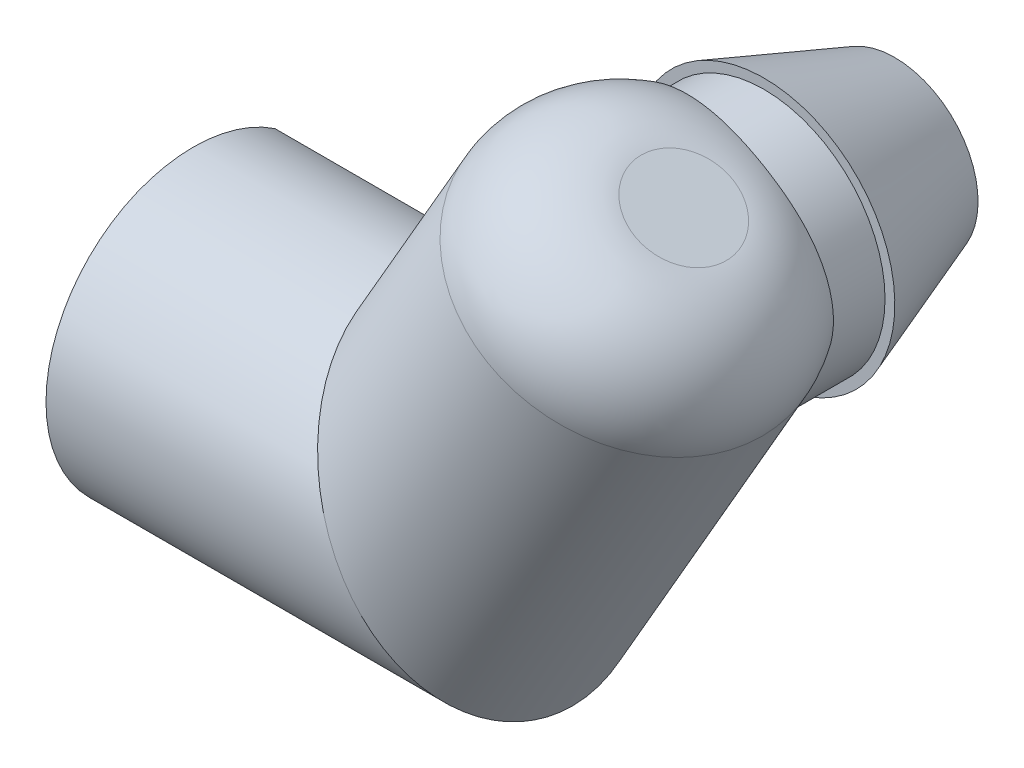
ISO-10303-21;
HEADER;
FILE_DESCRIPTION(('STEP AP214'),'2;1');
FILE_NAME('part.step','',(''),(''),'','','');
FILE_SCHEMA(('AUTOMOTIVE_DESIGN { 1 0 10303 214 1 1 1 1 }'));
ENDSEC;
DATA;
#1=APPLICATION_CONTEXT('core data for automotive mechanical design processes');
#2=APPLICATION_PROTOCOL_DEFINITION('international standard','automotive_design',2000,#1);
#3=PRODUCT_CONTEXT('',#1,'mechanical');
#4=PRODUCT('Part','Part','',(#3));
#5=PRODUCT_RELATED_PRODUCT_CATEGORY('part','',(#4));
#6=PRODUCT_DEFINITION_FORMATION('','',#4);
#7=PRODUCT_DEFINITION_CONTEXT('part definition',#1,'design');
#8=PRODUCT_DEFINITION('design','',#6,#7);
#9=PRODUCT_DEFINITION_SHAPE('','',#8);
#10=(LENGTH_UNIT() NAMED_UNIT(*) SI_UNIT(.MILLI.,.METRE.));
#11=(NAMED_UNIT(*) PLANE_ANGLE_UNIT() SI_UNIT($,.RADIAN.));
#12=(NAMED_UNIT(*) SI_UNIT($,.STERADIAN.) SOLID_ANGLE_UNIT());
#13=UNCERTAINTY_MEASURE_WITH_UNIT(LENGTH_MEASURE(1.E-05),#10,'distance_accuracy_value','');
#14=(GEOMETRIC_REPRESENTATION_CONTEXT(3) GLOBAL_UNCERTAINTY_ASSIGNED_CONTEXT((#13)) GLOBAL_UNIT_ASSIGNED_CONTEXT((#10,
#11,#12)) REPRESENTATION_CONTEXT('',''));
#15=CARTESIAN_POINT('',(0.,0.,0.));
#16=DIRECTION('',(0.,0.,1.));
#17=DIRECTION('',(1.,0.,0.));
#18=AXIS2_PLACEMENT_3D('',#15,#16,#17);
#19=CARTESIAN_POINT('',(3.,5.19615242270663,0.));
#20=DIRECTION('',(0.5,0.866025403784439,0.));
#21=DIRECTION('',(0.,0.,-1.));
#22=AXIS2_PLACEMENT_3D('',#19,#20,#21);
#23=PLANE('',#22);
#24=CARTESIAN_POINT('',(3.,5.19615242270663,0.));
#25=DIRECTION('',(0.5,0.866025403784439,0.));
#26=DIRECTION('',(-0.866025403784439,0.5,0.));
#27=AXIS2_PLACEMENT_3D('',#24,#25,#26);
#28=CIRCLE('',#27,0.749999999999999);
#29=CARTESIAN_POINT('',(2.35048094716167,5.57115242270663,0.));
#30=VERTEX_POINT('',#29);
#31=EDGE_CURVE('E197',#30,#30,#28,.T.);
#32=ORIENTED_EDGE('',*,*,#31,.T.);
#33=EDGE_LOOP('',(#32));
#34=FACE_BOUND('',#33,.T.);
#35=ADVANCED_FACE('F46',(#34),#23,.T.);
#36=CARTESIAN_POINT('',(-4.5,0.,0.));
#37=DIRECTION('',(1.,0.,0.));
#38=DIRECTION('',(0.,0.,-1.));
#39=AXIS2_PLACEMENT_3D('',#36,#37,#38);
#40=PLANE('',#39);
#41=CARTESIAN_POINT('',(-4.5,0.,0.));
#42=DIRECTION('',(1.,0.,0.));
#43=DIRECTION('',(0.,0.,-1.));
#44=AXIS2_PLACEMENT_3D('',#41,#42,#43);
#45=CIRCLE('',#44,1.125);
#46=CARTESIAN_POINT('',(-4.5,0.,-1.125));
#47=VERTEX_POINT('',#46);
#48=EDGE_CURVE('E185',#47,#47,#45,.T.);
#49=ORIENTED_EDGE('',*,*,#48,.T.);
#50=EDGE_LOOP('',(#49));
#51=FACE_BOUND('',#50,.T.);
#52=CARTESIAN_POINT('',(-4.5,0.,0.));
#53=DIRECTION('',(1.,0.,0.));
#54=DIRECTION('',(0.,0.,-1.));
#55=AXIS2_PLACEMENT_3D('',#52,#53,#54);
#56=CIRCLE('',#55,2.25);
#57=CARTESIAN_POINT('',(-4.5,1.87082869338697,-1.25));
#58=VERTEX_POINT('',#57);
#59=CARTESIAN_POINT('',(-4.5,-1.87082869338697,-1.25));
#60=VERTEX_POINT('',#59);
#61=EDGE_CURVE('E189',#58,#60,#56,.T.);
#62=ORIENTED_EDGE('',*,*,#61,.F.);
#63=DIRECTION('',(0.,-1.,0.));
#64=VECTOR('',#63,1.);
#65=CARTESIAN_POINT('',(-4.5,0.,-1.25));
#66=LINE('',#65,#64);
#67=EDGE_CURVE('E177',#58,#60,#66,.T.);
#68=ORIENTED_EDGE('',*,*,#67,.T.);
#69=EDGE_LOOP('',(#62,#68));
#70=FACE_BOUND('',#69,.T.);
#71=ADVANCED_FACE('F232',(#51,#70),#40,.F.);
#72=CARTESIAN_POINT('',(-1.47894191624432,-2.56160254037844,0.));
#73=DIRECTION('',(0.5,0.866025403784439,0.));
#74=DIRECTION('',(-0.866025403784439,0.5,0.));
#75=AXIS2_PLACEMENT_3D('',#72,#73,#74);
#76=CYLINDRICAL_SURFACE('',#75,2.25);
#77=DIRECTION('',(0.5,0.866025403784439,0.));
#78=VECTOR('',#77,1.);
#79=CARTESIAN_POINT('',(0.141243258357642,-3.49701688707193,-1.25));
#80=LINE('',#79,#78);
#81=CARTESIAN_POINT('',(3.87018517460236,2.96169997032885,-1.25));
#82=VERTEX_POINT('',#81);
#83=CARTESIAN_POINT('',(1.08012344973464,-1.87082869338697,-1.25));
#84=VERTEX_POINT('',#83);
#85=EDGE_CURVE('E168',#82,#84,#80,.F.);
#86=ORIENTED_EDGE('',*,*,#85,.F.);
#87=CARTESIAN_POINT('',(2.25,3.89711431702997,0.));
#88=DIRECTION('',(0.5,0.866025403784439,0.));
#89=DIRECTION('',(-0.866025403784439,0.5,0.));
#90=AXIS2_PLACEMENT_3D('',#87,#88,#89);
#91=CIRCLE('',#90,2.25);
#92=CARTESIAN_POINT('',(0.629814825398036,4.83252866372346,-1.25));
#93=VERTEX_POINT('',#92);
#94=EDGE_CURVE('E201',#82,#93,#91,.F.);
#95=ORIENTED_EDGE('',*,*,#94,.T.);
#96=DIRECTION('',(0.5,0.866025403784439,0.));
#97=VECTOR('',#96,1.);
#98=CARTESIAN_POINT('',(-3.09912709084629,-1.62618819368496,-1.25));
#99=LINE('',#98,#97);
#100=CARTESIAN_POINT('',(-1.08012344973464,1.87082869338697,-1.25));
#101=VERTEX_POINT('',#100);
#102=EDGE_CURVE('E71',#101,#93,#99,.T.);
#103=ORIENTED_EDGE('',*,*,#102,.F.);
#104=CARTESIAN_POINT('',(0.,0.,0.));
#105=DIRECTION('',(0.866025403784439,0.5,0.));
#106=DIRECTION('',(0.5,-0.866025403784439,0.));
#107=AXIS2_PLACEMENT_3D('',#104,#105,#106);
#108=ELLIPSE('',#107,2.59807621135332,2.25);
#109=EDGE_CURVE('E193',#84,#101,#108,.F.);
#110=ORIENTED_EDGE('',*,*,#109,.F.);
#111=EDGE_LOOP('',(#86,#95,#103,#110));
#112=FACE_BOUND('',#111,.T.);
#113=ADVANCED_FACE('F228',(#112),#76,.T.);
#114=CARTESIAN_POINT('',(-4.5,0.,0.));
#115=DIRECTION('',(1.,0.,0.));
#116=DIRECTION('',(0.,0.,-1.));
#117=AXIS2_PLACEMENT_3D('',#114,#115,#116);
#118=CYLINDRICAL_SURFACE('',#117,2.25);
#119=DIRECTION('',(1.,0.,0.));
#120=VECTOR('',#119,1.);
#121=CARTESIAN_POINT('',(-4.5,-1.87082869338697,-1.25));
#122=LINE('',#121,#120);
#123=EDGE_CURVE('E174',#84,#60,#122,.F.);
#124=ORIENTED_EDGE('',*,*,#123,.F.);
#125=ORIENTED_EDGE('',*,*,#109,.T.);
#126=DIRECTION('',(1.,0.,0.));
#127=VECTOR('',#126,1.);
#128=CARTESIAN_POINT('',(-4.5,1.87082869338697,-1.25));
#129=LINE('',#128,#127);
#130=EDGE_CURVE('E171',#58,#101,#129,.T.);
#131=ORIENTED_EDGE('',*,*,#130,.F.);
#132=ORIENTED_EDGE('',*,*,#61,.T.);
#133=EDGE_LOOP('',(#124,#125,#131,#132));
#134=FACE_BOUND('',#133,.T.);
#135=ADVANCED_FACE('F225',(#134),#118,.T.);
#136=CARTESIAN_POINT('',(2.25,3.89711431702997,0.));
#137=DIRECTION('',(0.5,0.866025403784439,0.));
#138=DIRECTION('',(-0.866025403784439,0.5,0.));
#139=AXIS2_PLACEMENT_3D('',#136,#137,#138);
#140=DEGENERATE_TOROIDAL_SURFACE('',#139,0.749999999999999,1.5,.T.);
#141=CARTESIAN_POINT('',(2.76882253032927,5.22301415914836,-1.25));
#142=CARTESIAN_POINT('',(2.83878601189705,5.18820996694728,-1.25));
#143=CARTESIAN_POINT('',(2.90752373776387,5.15094444709369,-1.25));
#144=CARTESIAN_POINT('',(3.0424477556737,5.07198939018065,-1.25));
#145=CARTESIAN_POINT('',(3.10863287233132,5.0302978474841,-1.25));
#146=CARTESIAN_POINT('',(3.23756384943671,4.94241510843654,-1.25));
#147=CARTESIAN_POINT('',(3.30032318479026,4.89624387905459,-1.25));
#148=CARTESIAN_POINT('',(3.42154530029649,4.79858700891688,-1.25));
#149=CARTESIAN_POINT('',(3.48001048750219,4.74710438495034,-1.25));
#150=CARTESIAN_POINT('',(3.60133951580253,4.62810121790016,-1.25));
#151=CARTESIAN_POINT('',(3.66304303436849,4.55937105525047,-1.25));
#152=CARTESIAN_POINT('',(3.77517523278892,4.41321792378568,-1.25));
#153=CARTESIAN_POINT('',(3.82561383076,4.33580269262962,-1.25));
#154=CARTESIAN_POINT('',(3.91256879516992,4.17237874978207,-1.25));
#155=CARTESIAN_POINT('',(3.94893873914843,4.08629082947665,-1.25));
#156=CARTESIAN_POINT('',(4.00416284000441,3.90857132837355,-1.25));
#157=CARTESIAN_POINT('',(4.02302070327241,3.81694092500415,-1.25));
#158=CARTESIAN_POINT('',(4.04007288762766,3.64396505627365,-1.25));
#159=CARTESIAN_POINT('',(4.04066033382444,3.56285334689579,-1.25));
#160=CARTESIAN_POINT('',(4.02661892544629,3.40197085098637,-1.25));
#161=CARTESIAN_POINT('',(4.01200212979591,3.32219905268627,-1.25));
#162=CARTESIAN_POINT('',(3.97000071930664,3.17470851145254,-1.25));
#163=CARTESIAN_POINT('',(3.94403742781129,3.10658177737824,-1.25));
#164=CARTESIAN_POINT('',(3.88066648004697,2.97588052894349,-1.25));
#165=CARTESIAN_POINT('',(3.8432615750651,2.91330468445971,-1.25));
#166=CARTESIAN_POINT('',(3.75952874460114,2.79749822624789,-1.25));
#167=CARTESIAN_POINT('',(3.71352541609736,2.74403228560709,-1.25));
#168=CARTESIAN_POINT('',(3.613273607413,2.64551471482593,-1.25));
#169=CARTESIAN_POINT('',(3.55902622434571,2.60046196683893,-1.25));
#170=CARTESIAN_POINT('',(3.44338325404398,2.51945348753679,-1.25));
#171=CARTESIAN_POINT('',(3.38192631961752,2.48358554493413,-1.25));
#172=CARTESIAN_POINT('',(3.25406921745253,2.42212662966504,-1.25));
#173=CARTESIAN_POINT('',(3.18766698270805,2.39653998321194,-1.25));
#174=CARTESIAN_POINT('',(3.04831667352323,2.3548114300683,-1.25));
#175=CARTESIAN_POINT('',(2.97520736074134,2.33921050620541,-1.25));
#176=CARTESIAN_POINT('',(2.82758314658712,2.31920960417219,-1.25));
#177=CARTESIAN_POINT('',(2.75306910570641,2.31480297982011,-1.25));
#178=CARTESIAN_POINT('',(2.57477994355988,2.31665407462239,-1.25));
#179=CARTESIAN_POINT('',(2.47104139778153,2.32779673803108,-1.25));
#180=CARTESIAN_POINT('',(2.31784845093846,2.35696611591871,-1.25));
#181=CARTESIAN_POINT('',(2.26706218530228,2.36881066537502,-1.25));
#182=CARTESIAN_POINT('',(2.16647438454394,2.3961511073304,-1.25));
#183=CARTESIAN_POINT('',(2.11667281181362,2.41164686008675,-1.25));
#184=CARTESIAN_POINT('',(1.98547402608927,2.45710336077601,-1.25));
#185=CARTESIAN_POINT('',(1.90504215690615,2.48983905544764,-1.25));
#186=CARTESIAN_POINT('',(1.74716900834114,2.56196522228046,-1.25));
#187=CARTESIAN_POINT('',(1.66973144815453,2.60136366332485,-1.25));
#188=CARTESIAN_POINT('',(1.51789007492057,2.68570008575924,-1.25));
#189=CARTESIAN_POINT('',(1.44348785149805,2.73064092140732,-1.25));
#190=CARTESIAN_POINT('',(1.29841936353685,2.82610728164475,-1.25));
#191=CARTESIAN_POINT('',(1.22774923874489,2.87662686178315,-1.25));
#192=CARTESIAN_POINT('',(1.11932337803505,2.96224002368142,-1.25));
#193=CARTESIAN_POINT('',(1.07990127203737,2.99521910875571,-1.25));
#194=CARTESIAN_POINT('',(1.00328343054179,3.06365770781396,-1.25));
#195=CARTESIAN_POINT('',(0.966087638173963,3.09911715838815,-1.25));
#196=CARTESIAN_POINT('',(0.858826856983154,3.20921873994056,-1.25));
#197=CARTESIAN_POINT('',(0.792707427791544,3.28787473087939,-1.25));
#198=CARTESIAN_POINT('',(0.68562889611132,3.44125583495667,-1.25));
#199=CARTESIAN_POINT('',(0.642296919909629,3.51431669881696,-1.25));
#200=CARTESIAN_POINT('',(0.568254062409525,3.66675883312603,-1.25));
#201=CARTESIAN_POINT('',(0.53755502102077,3.74614594991817,-1.25));
#202=CARTESIAN_POINT('',(0.490773612520746,3.90970430864653,-1.25));
#203=CARTESIAN_POINT('',(0.474782215272155,3.99390194905053,-1.25));
#204=CARTESIAN_POINT('',(0.459214401015466,4.16379931493219,-1.25));
#205=CARTESIAN_POINT('',(0.459625169606661,4.24949781551994,-1.25));
#206=CARTESIAN_POINT('',(0.476379752691128,4.40923016088565,-1.25));
#207=CARTESIAN_POINT('',(0.490866028825033,4.48346200520048,-1.25));
#208=CARTESIAN_POINT('',(0.532875619484055,4.62813911661286,-1.25));
#209=CARTESIAN_POINT('',(0.560394110820189,4.6985857738671,-1.25));
#210=CARTESIAN_POINT('',(0.625714671446492,4.82944371746596,-1.25));
#211=CARTESIAN_POINT('',(0.662828181525318,4.89020000899697,-1.25));
#212=CARTESIAN_POINT('',(0.746816201990236,5.00453098249614,-1.25));
#213=CARTESIAN_POINT('',(0.793689256457138,5.05810673369295,-1.25));
#214=CARTESIAN_POINT('',(0.895302353570424,5.15618632793598,-1.25));
#215=CARTESIAN_POINT('',(0.949969258523963,5.20076611508682,-1.25));
#216=CARTESIAN_POINT('',(1.06582739223811,5.28040584937879,-1.25));
#217=CARTESIAN_POINT('',(1.12701870618722,5.31546567219758,-1.25));
#218=CARTESIAN_POINT('',(1.25603840457472,5.37634503130925,-1.25));
#219=CARTESIAN_POINT('',(1.32400934914753,5.40186139997097,-1.25));
#220=CARTESIAN_POINT('',(1.46308312994784,5.442011805509,-1.25));
#221=CARTESIAN_POINT('',(1.5341871616844,5.45664164959304,-1.25));
#222=CARTESIAN_POINT('',(1.68338662985202,5.47608729487748,-1.25));
#223=CARTESIAN_POINT('',(1.76159229052823,5.48004126518966,-1.25));
#224=CARTESIAN_POINT('',(1.91766870564071,5.47668404773504,-1.25));
#225=CARTESIAN_POINT('',(1.99553959112014,5.46937776620781,-1.25));
#226=CARTESIAN_POINT('',(2.13312260540774,5.4476186907361,-1.25));
#227=CARTESIAN_POINT('',(2.19314734742679,5.43503470512446,-1.25));
#228=CARTESIAN_POINT('',(2.3118885286075,5.40466430444159,-1.25));
#229=CARTESIAN_POINT('',(2.37060418508865,5.38687486236935,-1.25));
#230=CARTESIAN_POINT('',(2.4868229581396,5.34683175289038,-1.25));
#231=CARTESIAN_POINT('',(2.54431790741139,5.32455471193729,-1.25));
#232=CARTESIAN_POINT('',(2.65773657108753,5.27636612527919,-1.25));
#233=CARTESIAN_POINT('',(2.71366053843083,5.25045516873231,-1.25));
#234=CARTESIAN_POINT('',(2.76882253032927,5.22301415914836,-1.25));
#235=B_SPLINE_CURVE_WITH_KNOTS('',3,(#141,#142,#143,#144,#145,#146,#147,#148,#149,#150,#151,
#152,#153,#154,#155,#156,#157,#158,#159,#160,#161,#162,#163,#164,#165,#166,#167,#168,#169,#170,
#171,#172,#173,#174,#175,#176,#177,#178,#179,#180,#181,#182,#183,#184,#185,#186,#187,#188,#189,
#190,#191,#192,#193,#194,#195,#196,#197,#198,#199,#200,#201,#202,#203,#204,#205,#206,#207,#208,
#209,#210,#211,#212,#213,#214,#215,#216,#217,#218,#219,#220,#221,#222,#223,#224,#225,#226,#227,
#228,#229,#230,#231,#232,#233,#234),.UNSPECIFIED.,.T.,.F.,(4,2,2,2,2,2,2,2,2,2,2,2,2,2,2,2,2,2,
2,2,2,2,2,2,2,2,2,2,2,2,2,2,2,2,2,2,2,2,2,2,2,2,2,2,2,2,4),(0.,0.23438798440669,
0.468882637992451,0.702376323444494,0.93573811073107,1.21190565453802,1.48782908162622,
1.76655157149598,2.04521505695532,2.28719943446279,2.5289920333847,2.74663043881367,
2.96421655129943,3.17482534342452,3.3854061323755,3.59793026544326,3.81054373202733,
4.03387245347089,4.25706855111464,4.56819011471147,4.7245378626682,4.88087962768977,
5.1409758739427,5.40138543370549,5.66192966529886,5.92219890419679,6.07629229186219,
6.23038174161763,6.5371347976684,6.79094892089219,7.04500038637828,7.30061284854124,
7.55602561412674,7.78175030084016,8.00739151264139,8.21995324568357,8.43248329166654,
8.64313626844578,8.8537919960348,9.07066334109022,9.28761816793463,9.52162679979928,
9.75553349985254,9.93927363837259,10.1231208358295,10.3079515779011,10.4927523883697),.UNSPECIFIED.);
#236=EDGE_CURVE('E56',#93,#82,#235,.T.);
#237=ORIENTED_EDGE('',*,*,#236,.F.);
#238=ORIENTED_EDGE('',*,*,#94,.F.);
#239=EDGE_LOOP('',(#237,#238));
#240=FACE_BOUND('',#239,.T.);
#241=ORIENTED_EDGE('',*,*,#31,.F.);
#242=EDGE_LOOP('',(#241));
#243=FACE_BOUND('',#242,.T.);
#244=ADVANCED_FACE('F48',(#240,#243),#140,.T.);
#245=CARTESIAN_POINT('',(1.2,0.,0.));
#246=DIRECTION('',(-1.,0.,0.));
#247=DIRECTION('',(0.,0.,1.));
#248=AXIS2_PLACEMENT_3D('',#245,#246,#247);
#249=PLANE('',#248);
#250=CARTESIAN_POINT('',(1.2,0.,0.));
#251=DIRECTION('',(-1.,0.,0.));
#252=DIRECTION('',(0.,0.,1.));
#253=AXIS2_PLACEMENT_3D('',#250,#251,#252);
#254=CIRCLE('',#253,1.125);
#255=CARTESIAN_POINT('',(1.2,0.,1.125));
#256=VERTEX_POINT('',#255);
#257=EDGE_CURVE('E181',#256,#256,#254,.T.);
#258=ORIENTED_EDGE('',*,*,#257,.T.);
#259=EDGE_LOOP('',(#258));
#260=FACE_BOUND('',#259,.T.);
#261=ADVANCED_FACE('F220',(#260),#249,.T.);
#262=CARTESIAN_POINT('',(-5.5,0.,0.));
#263=DIRECTION('',(1.,0.,0.));
#264=DIRECTION('',(0.,0.,-1.));
#265=AXIS2_PLACEMENT_3D('',#262,#263,#264);
#266=CYLINDRICAL_SURFACE('',#265,1.125);
#267=ORIENTED_EDGE('',*,*,#48,.F.);
#268=EDGE_LOOP('',(#267));
#269=FACE_BOUND('',#268,.T.);
#270=ORIENTED_EDGE('',*,*,#257,.F.);
#271=EDGE_LOOP('',(#270));
#272=FACE_BOUND('',#271,.T.);
#273=ADVANCED_FACE('F215',(#269,#272),#266,.F.);
#274=CARTESIAN_POINT('',(0.,0.,-1.25));
#275=DIRECTION('',(0.,0.,1.));
#276=DIRECTION('',(1.,0.,0.));
#277=AXIS2_PLACEMENT_3D('',#274,#275,#276);
#278=PLANE('',#277);
#279=CARTESIAN_POINT('',(1.77741445898117,3.07857214906294,-1.25));
#280=DIRECTION('',(0.,0.,1.));
#281=DIRECTION('',(1.,0.,0.));
#282=AXIS2_PLACEMENT_3D('',#279,#280,#281);
#283=CIRCLE('',#282,1.85);
#284=CARTESIAN_POINT('',(3.62741445898117,3.07857214906294,-1.25));
#285=VERTEX_POINT('',#284);
#286=EDGE_CURVE('E11',#285,#285,#283,.F.);
#287=ORIENTED_EDGE('',*,*,#286,.F.);
#288=EDGE_LOOP('',(#287));
#289=FACE_BOUND('',#288,.T.);
#290=ORIENTED_EDGE('',*,*,#130,.T.);
#291=ORIENTED_EDGE('',*,*,#102,.T.);
#292=ORIENTED_EDGE('',*,*,#236,.T.);
#293=ORIENTED_EDGE('',*,*,#85,.T.);
#294=ORIENTED_EDGE('',*,*,#123,.T.);
#295=ORIENTED_EDGE('',*,*,#67,.F.);
#296=EDGE_LOOP('',(#290,#291,#292,#293,#294,#295));
#297=FACE_BOUND('',#296,.T.);
#298=ADVANCED_FACE('F209',(#289,#297),#278,.F.);
#299=CARTESIAN_POINT('',(1.77741445898117,3.07857214906294,-2.45));
#300=DIRECTION('',(0.,0.,1.));
#301=DIRECTION('',(1.,0.,0.));
#302=AXIS2_PLACEMENT_3D('',#299,#300,#301);
#303=CYLINDRICAL_SURFACE('',#302,1.85);
#304=CARTESIAN_POINT('',(1.77741445898117,3.07857214906294,-2.45));
#305=DIRECTION('',(0.,0.,-1.));
#306=DIRECTION('',(-1.,0.,0.));
#307=AXIS2_PLACEMENT_3D('',#304,#305,#306);
#308=CIRCLE('',#307,1.85);
#309=CARTESIAN_POINT('',(-0.0314269360411833,3.46663504042667,-2.45));
#310=VERTEX_POINT('',#309);
#311=CARTESIAN_POINT('',(-0.0460973288215942,2.76663504042667,-2.45));
#312=VERTEX_POINT('',#311);
#313=EDGE_CURVE('E162',#310,#312,#308,.T.);
#314=ORIENTED_EDGE('',*,*,#313,.F.);
#315=DIRECTION('',(0.,0.,1.));
#316=VECTOR('',#315,1.);
#317=CARTESIAN_POINT('',(-0.0314269360411833,3.46663504042667,-2.45));
#318=LINE('',#317,#316);
#319=CARTESIAN_POINT('',(-0.0314269360411833,3.46663504042667,-2.05));
#320=VERTEX_POINT('',#319);
#321=EDGE_CURVE('E154',#310,#320,#318,.T.);
#322=ORIENTED_EDGE('',*,*,#321,.T.);
#323=CARTESIAN_POINT('',(1.77741445898117,3.07857214906294,-2.05));
#324=DIRECTION('',(0.,0.,-1.));
#325=DIRECTION('',(-1.,0.,0.));
#326=AXIS2_PLACEMENT_3D('',#323,#324,#325);
#327=CIRCLE('',#326,1.85);
#328=CARTESIAN_POINT('',(-0.0460973288215942,2.76663504042667,-2.05));
#329=VERTEX_POINT('',#328);
#330=EDGE_CURVE('E148',#329,#320,#327,.T.);
#331=ORIENTED_EDGE('',*,*,#330,.F.);
#332=DIRECTION('',(0.,0.,1.));
#333=VECTOR('',#332,1.);
#334=CARTESIAN_POINT('',(-0.0460973288215942,2.76663504042667,-2.45));
#335=LINE('',#334,#333);
#336=EDGE_CURVE('E381',#329,#312,#335,.F.);
#337=ORIENTED_EDGE('',*,*,#336,.T.);
#338=EDGE_LOOP('',(#314,#322,#331,#337));
#339=FACE_BOUND('',#338,.T.);
#340=ORIENTED_EDGE('',*,*,#286,.T.);
#341=EDGE_LOOP('',(#340));
#342=FACE_BOUND('',#341,.T.);
#343=ADVANCED_FACE('F214',(#339,#342),#303,.T.);
#344=CARTESIAN_POINT('',(1.77741445898117,3.07857214906294,-2.45));
#345=DIRECTION('',(0.,0.,1.));
#346=DIRECTION('',(-1.,0.,0.));
#347=AXIS2_PLACEMENT_3D('',#344,#345,#346);
#348=CONICAL_SURFACE('',#347,2.,0.349065850398867);
#349=CARTESIAN_POINT('',(1.77741445898117,3.07857214906294,-4.45));
#350=DIRECTION('',(0.,0.,-1.));
#351=DIRECTION('',(-1.,0.,0.));
#352=AXIS2_PLACEMENT_3D('',#349,#350,#351);
#353=CIRCLE('',#352,1.27205953146759);
#354=CARTESIAN_POINT('',(0.565992714111131,3.46663504042667,-4.45));
#355=VERTEX_POINT('',#354);
#356=CARTESIAN_POINT('',(0.544194814370694,2.76663504042667,-4.45));
#357=VERTEX_POINT('',#356);
#358=EDGE_CURVE('E139',#355,#357,#353,.T.);
#359=ORIENTED_EDGE('',*,*,#358,.F.);
#360=CARTESIAN_POINT('',(1.68458141656166,3.46663504042667,-6.8486776720888));
#361=CARTESIAN_POINT('',(1.67377089174622,3.46663504042667,-6.84173177073089));
#362=CARTESIAN_POINT('',(1.66349283560153,3.46663504042667,-6.83405816777647));
#363=CARTESIAN_POINT('',(1.6438629295756,3.46663504042667,-6.81768717309801));
#364=CARTESIAN_POINT('',(1.63450676620371,3.46663504042667,-6.80899501129484));
#365=CARTESIAN_POINT('',(1.60767523511878,3.46663504042667,-6.78212631420796));
#366=CARTESIAN_POINT('',(1.59119513958676,3.46663504042667,-6.76297825679974));
#367=CARTESIAN_POINT('',(1.56102708471366,3.46663504042667,-6.7247150980945));
#368=CARTESIAN_POINT('',(1.5472256164591,3.46663504042667,-6.70568559233913));
#369=CARTESIAN_POINT('',(1.52066853562139,3.46663504042667,-6.6669039222853));
#370=CARTESIAN_POINT('',(1.50791331514073,3.46663504042667,-6.64715149103036));
#371=CARTESIAN_POINT('',(1.47073880628135,3.46663504042667,-6.58714637532466));
#372=CARTESIAN_POINT('',(1.44745043510747,3.46663504042667,-6.54620046562674));
#373=CARTESIAN_POINT('',(1.40219050403799,3.46663504042667,-6.46257405590289));
#374=CARTESIAN_POINT('',(1.38025364743063,3.46663504042667,-6.41987529077029));
#375=CARTESIAN_POINT('',(1.33760040717552,3.46663504042667,-6.33393826547906));
#376=CARTESIAN_POINT('',(1.31688260366099,3.46663504042667,-6.29070070699986));
#377=CARTESIAN_POINT('',(1.25655651423559,3.46663504042667,-6.16174654752863));
#378=CARTESIAN_POINT('',(1.2181091461334,3.46663504042667,-6.07549059416128));
#379=CARTESIAN_POINT('',(1.14291439907062,3.46663504042667,-5.90223650095342));
#380=CARTESIAN_POINT('',(1.106167292292,3.46663504042667,-5.81523824490535));
#381=CARTESIAN_POINT('',(1.03371992130256,3.46663504042667,-5.64072357954121));
#382=CARTESIAN_POINT('',(0.998020544579732,3.46663504042667,-5.55320680235712));
#383=CARTESIAN_POINT('',(0.927345442545034,3.46663504042667,-5.3778899786417));
#384=CARTESIAN_POINT('',(0.892369666433567,3.46663504042667,-5.29008995249921));
#385=CARTESIAN_POINT('',(0.789123888919529,3.46663504042667,-5.02875528159149));
#386=CARTESIAN_POINT('',(0.7215760908191,3.46663504042667,-4.85493568786203));
#387=CARTESIAN_POINT('',(0.587581723677892,3.46663504042667,-4.50694802727575));
#388=CARTESIAN_POINT('',(0.521134760474619,3.46663504042667,-4.33278011131714));
#389=CARTESIAN_POINT('',(0.326833969640066,3.46663504042667,-3.82058797870052));
#390=CARTESIAN_POINT('',(0.199887267586226,3.46663504042667,-3.48221995465763));
#391=CARTESIAN_POINT('',(-0.0528856794299771,3.46663504042667,-2.80500720064685));
#392=CARTESIAN_POINT('',(-0.178711745287705,3.46663504042667,-2.4661624041562));
#393=CARTESIAN_POINT('',(-0.432252308727382,3.46663504042667,-1.78137803840738));
#394=CARTESIAN_POINT('',(-0.559953542584917,3.46663504042667,-1.43543355731525));
#395=CARTESIAN_POINT('',(-0.814902483953605,3.46663504042667,-0.743444791542309));
#396=CARTESIAN_POINT('',(-0.942150265434494,3.46663504042667,-0.397400534124006));
#397=CARTESIAN_POINT('',(-1.0693043245413,3.46663504042667,-0.0513223278636551));
#398=B_SPLINE_CURVE_WITH_KNOTS('',3,(#360,#361,#362,#363,#364,#365,#366,#367,#368,#369,#370,
#371,#372,#373,#374,#375,#376,#377,#378,#379,#380,#381,#382,#383,#384,#385,#386,#387,#388,#389,
#390,#391,#392,#393,#394,#395,#396,#397),.UNSPECIFIED.,.F.,.F.,(4,2,2,2,2,2,2,2,2,2,2,2,2,2,2,2,
2,2,4),(0.,0.0384384883023395,0.0766876099489771,0.152294850304922,0.222781544066415,
0.293294534579253,0.434522484997461,0.578515166135122,0.722336672385861,1.00560630779833,
1.28892113391368,1.57246939591833,1.85599768370687,2.41543897214837,2.97467541939285,
4.05886267520497,5.14322020799425,6.24950481503369,7.35559984020088),.UNSPECIFIED.);
#399=CARTESIAN_POINT('',(-0.184576160860427,3.46663504042667,-2.45));
#400=VERTEX_POINT('',#399);
#401=EDGE_CURVE('E386',#355,#400,#398,.T.);
#402=ORIENTED_EDGE('',*,*,#401,.T.);
#403=CARTESIAN_POINT('',(1.77741445898117,3.07857214906294,-2.45));
#404=DIRECTION('',(0.,0.,-1.));
#405=DIRECTION('',(-1.,0.,0.));
#406=AXIS2_PLACEMENT_3D('',#403,#404,#405);
#407=CIRCLE('',#406,2.);
#408=CARTESIAN_POINT('',(-0.198109582951915,2.76663504042667,-2.45));
#409=VERTEX_POINT('',#408);
#410=EDGE_CURVE('E152',#400,#409,#407,.T.);
#411=ORIENTED_EDGE('',*,*,#410,.T.);
#412=CARTESIAN_POINT('',(-1.07864854459014,2.76663504042667,-0.0513223278636475));
#413=CARTESIAN_POINT('',(-0.95052815923996,2.76663504042667,-0.401200855565559));
#414=CARTESIAN_POINT('',(-0.822346697366792,2.76663504042667,-0.751057229535196));
#415=CARTESIAN_POINT('',(-0.565713888791098,2.76663504042667,-1.45062995295448));
#416=CARTESIAN_POINT('',(-0.437262571333337,2.76663504042667,-1.80034631313489));
#417=CARTESIAN_POINT('',(-0.179962370267813,2.76663504042667,-2.49948937636176));
#418=CARTESIAN_POINT('',(-0.051113646923996,2.76663504042667,-2.84891613839926));
#419=CARTESIAN_POINT('',(0.207386554675265,2.76663504042667,-3.547513990873));
#420=CARTESIAN_POINT('',(0.337038113211084,2.76663504042667,-3.89668505170478));
#421=CARTESIAN_POINT('',(0.508614031963517,2.76663504042667,-4.35523651143774));
#422=CARTESIAN_POINT('',(0.549749811122546,2.76663504042667,-4.46491174979162));
#423=CARTESIAN_POINT('',(0.632263341372217,2.76663504042667,-4.6841676538823));
#424=CARTESIAN_POINT('',(0.673641085550311,2.76663504042667,-4.79374832221917));
#425=CARTESIAN_POINT('',(0.756719049606901,2.76663504042667,-5.01275578872821));
#426=CARTESIAN_POINT('',(0.798419185177146,2.76663504042667,-5.1221826188364));
#427=CARTESIAN_POINT('',(0.882305992538706,2.76663504042667,-5.34086179075477));
#428=CARTESIAN_POINT('',(0.924492710556255,2.76663504042667,-5.45011411484519));
#429=CARTESIAN_POINT('',(1.00962894703889,2.76663504042667,-5.66842225772397));
#430=CARTESIAN_POINT('',(1.05257904288961,2.76663504042667,-5.77747785250411));
#431=CARTESIAN_POINT('',(1.11791341893438,2.76663504042667,-5.94067826761349));
#432=CARTESIAN_POINT('',(1.1398396469458,2.76663504042667,-5.99500626497341));
#433=CARTESIAN_POINT('',(1.18410869697335,2.76663504042667,-6.10349803372571));
#434=CARTESIAN_POINT('',(1.20645155353304,2.76663504042667,-6.15766179106385));
#435=CARTESIAN_POINT('',(1.25173779577936,2.76663504042667,-6.26580953107762));
#436=CARTESIAN_POINT('',(1.27468182677879,2.76663504042667,-6.31979324405386));
#437=CARTESIAN_POINT('',(1.32140045606111,2.76663504042667,-6.42738877345526));
#438=CARTESIAN_POINT('',(1.34517486307177,2.76663504042667,-6.48100067215974));
#439=CARTESIAN_POINT('',(1.38183619050424,2.76663504042667,-6.56099926700241));
#440=CARTESIAN_POINT('',(1.39423078817247,2.76663504042667,-6.58761101783754));
#441=CARTESIAN_POINT('',(1.41945298605845,2.76663504042667,-6.64062517599886));
#442=CARTESIAN_POINT('',(1.43228053718246,2.76663504042667,-6.66702760664393));
#443=CARTESIAN_POINT('',(1.4585158180032,2.76663504042667,-6.71957236185929));
#444=CARTESIAN_POINT('',(1.47192400214013,2.76663504042667,-6.74571446225352));
#445=CARTESIAN_POINT('',(1.49957490517488,2.76663504042667,-6.79756488466785));
#446=CARTESIAN_POINT('',(1.51381795054813,2.76663504042667,-6.82327303185883));
#447=CARTESIAN_POINT('',(1.5286052516349,2.76663504042667,-6.84867767213632));
#448=B_SPLINE_CURVE_WITH_KNOTS('',3,(#412,#413,#414,#415,#416,#417,#418,#419,#420,#421,#422,
#423,#424,#425,#426,#427,#428,#429,#430,#431,#432,#433,#434,#435,#436,#437,#438,#439,#440,#441,
#442,#443,#444,#445,#446,#447),.UNSPECIFIED.,.F.,.F.,(4,2,2,2,2,2,2,2,2,2,2,2,2,2,2,2,2,4),(0.,
1.11779653859015,2.23547761690309,3.35275520627806,4.47014638374856,4.82155375516547,
5.17295113601483,5.52425953827073,5.87560159497006,6.22722176813069,6.40297789594007,
6.57874866144094,6.75471652875163,6.93064412680584,7.01871091177992,7.10676774395799,
7.19489478669907,7.28305652477314),.UNSPECIFIED.);
#449=EDGE_CURVE('E373',#409,#357,#448,.T.);
#450=ORIENTED_EDGE('',*,*,#449,.T.);
#451=EDGE_LOOP('',(#359,#402,#411,#450));
#452=FACE_BOUND('',#451,.T.);
#453=ADVANCED_FACE('F269',(#452),#348,.T.);
#454=CARTESIAN_POINT('',(1.77741445898117,3.07857214906294,-4.45));
#455=DIRECTION('',(0.,0.,-1.));
#456=DIRECTION('',(-1.,0.,0.));
#457=AXIS2_PLACEMENT_3D('',#454,#455,#456);
#458=PLANE('',#457);
#459=DIRECTION('',(1.,0.,0.));
#460=VECTOR('',#459,1.);
#461=CARTESIAN_POINT('',(1.10130839118897,3.46663504042667,-4.45));
#462=LINE('',#461,#460);
#463=CARTESIAN_POINT('',(1.02116900124511,3.46663504042667,-4.45));
#464=VERTEX_POINT('',#463);
#465=EDGE_CURVE('E141',#355,#464,#462,.T.);
#466=ORIENTED_EDGE('',*,*,#465,.F.);
#467=ORIENTED_EDGE('',*,*,#358,.T.);
#468=DIRECTION('',(-1.,0.,0.));
#469=VECTOR('',#468,1.);
#470=CARTESIAN_POINT('',(1.10130839118897,2.76663504042667,-4.45));
#471=LINE('',#470,#469);
#472=CARTESIAN_POINT('',(0.986721572801182,2.76663504042667,-4.45));
#473=VERTEX_POINT('',#472);
#474=EDGE_CURVE('E122',#473,#357,#471,.T.);
#475=ORIENTED_EDGE('',*,*,#474,.F.);
#476=CARTESIAN_POINT('',(1.77741445898117,3.07857214906294,-4.45));
#477=DIRECTION('',(0.,0.,-1.));
#478=DIRECTION('',(-1.,0.,0.));
#479=AXIS2_PLACEMENT_3D('',#476,#477,#478);
#480=CIRCLE('',#479,0.85);
#481=EDGE_CURVE('E137',#464,#473,#480,.T.);
#482=ORIENTED_EDGE('',*,*,#481,.F.);
#483=EDGE_LOOP('',(#466,#467,#475,#482));
#484=FACE_BOUND('',#483,.T.);
#485=ADVANCED_FACE('F136',(#484),#458,.T.);
#486=CARTESIAN_POINT('',(1.77741445898117,3.07857214906294,-2.45));
#487=DIRECTION('',(0.,0.,-1.));
#488=DIRECTION('',(-1.,0.,0.));
#489=AXIS2_PLACEMENT_3D('',#486,#487,#488);
#490=PLANE('',#489);
#491=ORIENTED_EDGE('',*,*,#410,.F.);
#492=DIRECTION('',(1.,0.,0.));
#493=VECTOR('',#492,1.);
#494=CARTESIAN_POINT('',(1.77741445898117,3.46663504042667,-2.45));
#495=LINE('',#494,#493);
#496=EDGE_CURVE('E395',#400,#310,#495,.T.);
#497=ORIENTED_EDGE('',*,*,#496,.T.);
#498=ORIENTED_EDGE('',*,*,#313,.T.);
#499=DIRECTION('',(-1.,0.,0.));
#500=VECTOR('',#499,1.);
#501=CARTESIAN_POINT('',(1.77741445898117,2.76663504042667,-2.45));
#502=LINE('',#501,#500);
#503=EDGE_CURVE('E130',#312,#409,#502,.T.);
#504=ORIENTED_EDGE('',*,*,#503,.T.);
#505=EDGE_LOOP('',(#491,#497,#498,#504));
#506=FACE_BOUND('',#505,.T.);
#507=ADVANCED_FACE('F284',(#506),#490,.F.);
#508=CARTESIAN_POINT('',(1.77741445898117,3.07857214906294,-2.05));
#509=DIRECTION('',(0.,0.,-1.));
#510=DIRECTION('',(-1.,0.,0.));
#511=AXIS2_PLACEMENT_3D('',#508,#509,#510);
#512=CYLINDRICAL_SURFACE('',#511,0.85);
#513=CARTESIAN_POINT('',(1.77741445898117,3.07857214906294,-2.05));
#514=DIRECTION('',(0.,0.,-1.));
#515=DIRECTION('',(-1.,0.,0.));
#516=AXIS2_PLACEMENT_3D('',#513,#514,#515);
#517=CIRCLE('',#516,0.85);
#518=CARTESIAN_POINT('',(1.02116900124511,3.46663504042667,-2.05));
#519=VERTEX_POINT('',#518);
#520=CARTESIAN_POINT('',(0.986721572801182,2.76663504042667,-2.05));
#521=VERTEX_POINT('',#520);
#522=EDGE_CURVE('E147',#519,#521,#517,.T.);
#523=ORIENTED_EDGE('',*,*,#522,.F.);
#524=DIRECTION('',(0.,0.,-1.));
#525=VECTOR('',#524,1.);
#526=CARTESIAN_POINT('',(1.02116900124511,3.46663504042667,-2.05));
#527=LINE('',#526,#525);
#528=EDGE_CURVE('E145',#519,#464,#527,.T.);
#529=ORIENTED_EDGE('',*,*,#528,.T.);
#530=ORIENTED_EDGE('',*,*,#481,.T.);
#531=DIRECTION('',(0.,0.,-1.));
#532=VECTOR('',#531,1.);
#533=CARTESIAN_POINT('',(0.986721572801182,2.76663504042667,-2.05));
#534=LINE('',#533,#532);
#535=EDGE_CURVE('E119',#473,#521,#534,.F.);
#536=ORIENTED_EDGE('',*,*,#535,.T.);
#537=EDGE_LOOP('',(#523,#529,#530,#536));
#538=FACE_BOUND('',#537,.T.);
#539=ADVANCED_FACE('F144',(#538),#512,.F.);
#540=CARTESIAN_POINT('',(1.77741445898117,3.07857214906294,-2.05));
#541=DIRECTION('',(0.,0.,-1.));
#542=DIRECTION('',(-1.,0.,0.));
#543=AXIS2_PLACEMENT_3D('',#540,#541,#542);
#544=PLANE('',#543);
#545=ORIENTED_EDGE('',*,*,#522,.T.);
#546=DIRECTION('',(-1.,0.,0.));
#547=VECTOR('',#546,1.);
#548=CARTESIAN_POINT('',(1.10130839118897,2.76663504042667,-2.05));
#549=LINE('',#548,#547);
#550=EDGE_CURVE('E125',#521,#329,#549,.T.);
#551=ORIENTED_EDGE('',*,*,#550,.T.);
#552=ORIENTED_EDGE('',*,*,#330,.T.);
#553=DIRECTION('',(1.,0.,0.));
#554=VECTOR('',#553,1.);
#555=CARTESIAN_POINT('',(1.10130839118897,3.46663504042667,-2.05));
#556=LINE('',#555,#554);
#557=EDGE_CURVE('E63',#320,#519,#556,.T.);
#558=ORIENTED_EDGE('',*,*,#557,.T.);
#559=EDGE_LOOP('',(#545,#551,#552,#558));
#560=FACE_BOUND('',#559,.T.);
#561=ADVANCED_FACE('F300',(#560),#544,.T.);
#562=CARTESIAN_POINT('',(1.10130839118897,3.46663504042667,-2.05));
#563=DIRECTION('',(0.,1.,0.));
#564=DIRECTION('',(0.,0.,1.));
#565=AXIS2_PLACEMENT_3D('',#562,#563,#564);
#566=PLANE('',#565);
#567=ORIENTED_EDGE('',*,*,#496,.F.);
#568=ORIENTED_EDGE('',*,*,#401,.F.);
#569=ORIENTED_EDGE('',*,*,#465,.T.);
#570=ORIENTED_EDGE('',*,*,#528,.F.);
#571=ORIENTED_EDGE('',*,*,#557,.F.);
#572=ORIENTED_EDGE('',*,*,#321,.F.);
#573=EDGE_LOOP('',(#567,#568,#569,#570,#571,#572));
#574=FACE_BOUND('',#573,.T.);
#575=ADVANCED_FACE('F309',(#574),#566,.F.);
#576=CARTESIAN_POINT('',(1.10130839118897,2.76663504042667,-2.05));
#577=DIRECTION('',(0.,-1.,0.));
#578=DIRECTION('',(0.,0.,-1.));
#579=AXIS2_PLACEMENT_3D('',#576,#577,#578);
#580=PLANE('',#579);
#581=ORIENTED_EDGE('',*,*,#550,.F.);
#582=ORIENTED_EDGE('',*,*,#535,.F.);
#583=ORIENTED_EDGE('',*,*,#474,.T.);
#584=ORIENTED_EDGE('',*,*,#449,.F.);
#585=ORIENTED_EDGE('',*,*,#503,.F.);
#586=ORIENTED_EDGE('',*,*,#336,.F.);
#587=EDGE_LOOP('',(#581,#582,#583,#584,#585,#586));
#588=FACE_BOUND('',#587,.T.);
#589=ADVANCED_FACE('F121',(#588),#580,.F.);
#590=CLOSED_SHELL('',(#35,#71,#113,#135,#244,#261,#273,#298,#343,#453,#485,#507,#539,#561,#575,#589));
#591=MANIFOLD_SOLID_BREP('B2',#590);
#592=ADVANCED_BREP_SHAPE_REPRESENTATION('',(#18,#591),#14);
#593=SHAPE_DEFINITION_REPRESENTATION(#9,#592);
ENDSEC;
END-ISO-10303-21;
